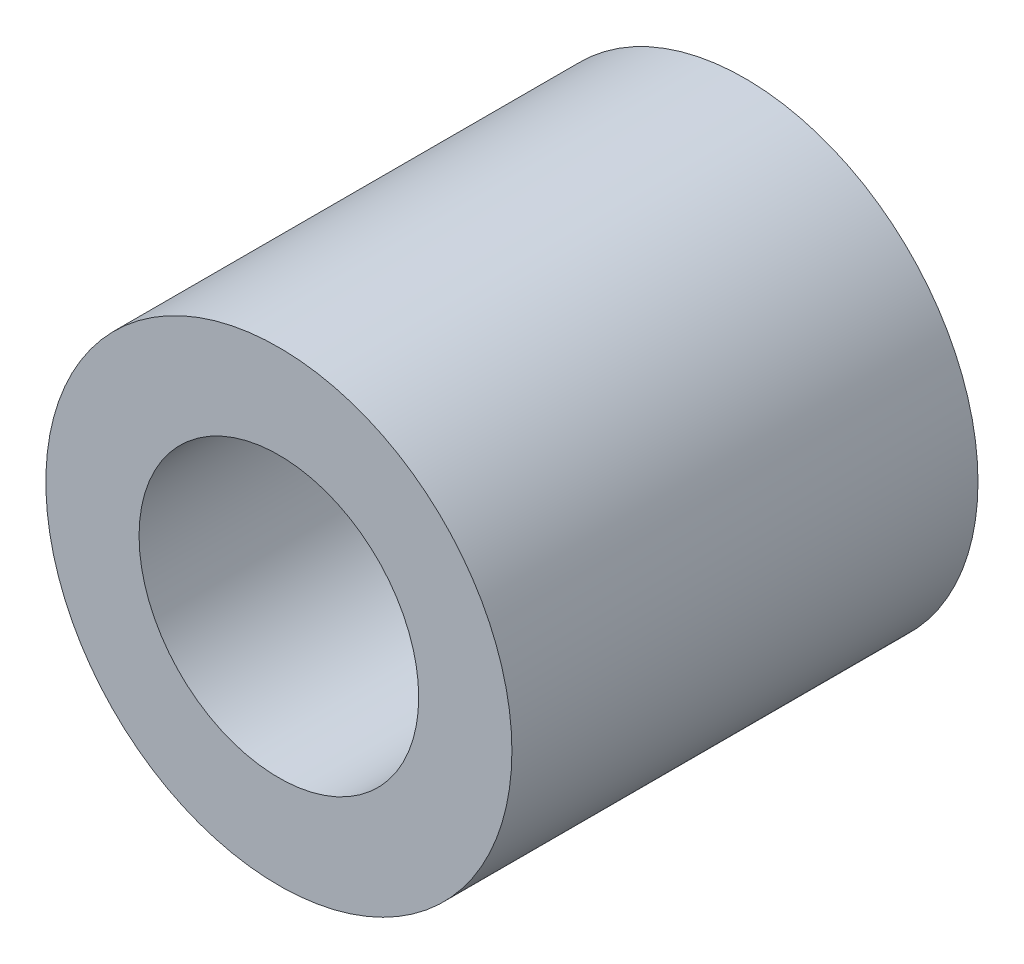
ISO-10303-21;
HEADER;
FILE_DESCRIPTION(('STEP AP214'),'2;1');
FILE_NAME('part.step','',(''),(''),'','','');
FILE_SCHEMA(('AUTOMOTIVE_DESIGN { 1 0 10303 214 1 1 1 1 }'));
ENDSEC;
DATA;
#1=APPLICATION_CONTEXT('core data for automotive mechanical design processes');
#2=APPLICATION_PROTOCOL_DEFINITION('international standard','automotive_design',2000,#1);
#3=PRODUCT_CONTEXT('',#1,'mechanical');
#4=PRODUCT('Part','Part','',(#3));
#5=PRODUCT_RELATED_PRODUCT_CATEGORY('part','',(#4));
#6=PRODUCT_DEFINITION_FORMATION('','',#4);
#7=PRODUCT_DEFINITION_CONTEXT('part definition',#1,'design');
#8=PRODUCT_DEFINITION('design','',#6,#7);
#9=PRODUCT_DEFINITION_SHAPE('','',#8);
#10=(LENGTH_UNIT() NAMED_UNIT(*) SI_UNIT(.MILLI.,.METRE.));
#11=(NAMED_UNIT(*) PLANE_ANGLE_UNIT() SI_UNIT($,.RADIAN.));
#12=(NAMED_UNIT(*) SI_UNIT($,.STERADIAN.) SOLID_ANGLE_UNIT());
#13=UNCERTAINTY_MEASURE_WITH_UNIT(LENGTH_MEASURE(1.E-05),#10,'distance_accuracy_value','');
#14=(GEOMETRIC_REPRESENTATION_CONTEXT(3) GLOBAL_UNCERTAINTY_ASSIGNED_CONTEXT((#13)) GLOBAL_UNIT_ASSIGNED_CONTEXT((#10,
#11,#12)) REPRESENTATION_CONTEXT('',''));
#15=CARTESIAN_POINT('',(0.,0.,0.));
#16=DIRECTION('',(0.,0.,1.));
#17=DIRECTION('',(1.,0.,0.));
#18=AXIS2_PLACEMENT_3D('',#15,#16,#17);
#19=CARTESIAN_POINT('',(0.,0.,5.));
#20=DIRECTION('',(0.,0.,1.));
#21=DIRECTION('',(1.,0.,0.));
#22=AXIS2_PLACEMENT_3D('',#19,#20,#21);
#23=PLANE('',#22);
#24=CARTESIAN_POINT('',(0.,0.,5.));
#25=DIRECTION('',(0.,0.,1.));
#26=DIRECTION('',(1.,0.,0.));
#27=AXIS2_PLACEMENT_3D('',#24,#25,#26);
#28=CIRCLE('',#27,2.5);
#29=CARTESIAN_POINT('',(2.5,0.,5.));
#30=VERTEX_POINT('',#29);
#31=EDGE_CURVE('E10',#30,#30,#28,.T.);
#32=ORIENTED_EDGE('',*,*,#31,.T.);
#33=EDGE_LOOP('',(#32));
#34=FACE_BOUND('',#33,.T.);
#35=CARTESIAN_POINT('',(0.,0.,5.));
#36=DIRECTION('',(0.,0.,1.));
#37=DIRECTION('',(1.,0.,0.));
#38=AXIS2_PLACEMENT_3D('',#35,#36,#37);
#39=CIRCLE('',#38,1.5);
#40=CARTESIAN_POINT('',(1.5,0.,5.));
#41=VERTEX_POINT('',#40);
#42=EDGE_CURVE('E54',#41,#41,#39,.T.);
#43=ORIENTED_EDGE('',*,*,#42,.F.);
#44=EDGE_LOOP('',(#43));
#45=FACE_BOUND('',#44,.T.);
#46=ADVANCED_FACE('F41',(#34,#45),#23,.T.);
#47=CARTESIAN_POINT('',(0.,0.,0.));
#48=DIRECTION('',(0.,0.,1.));
#49=DIRECTION('',(1.,0.,0.));
#50=AXIS2_PLACEMENT_3D('',#47,#48,#49);
#51=PLANE('',#50);
#52=CARTESIAN_POINT('',(0.,0.,0.));
#53=DIRECTION('',(0.,0.,1.));
#54=DIRECTION('',(1.,0.,0.));
#55=AXIS2_PLACEMENT_3D('',#52,#53,#54);
#56=CIRCLE('',#55,2.5);
#57=CARTESIAN_POINT('',(2.5,0.,0.));
#58=VERTEX_POINT('',#57);
#59=EDGE_CURVE('E45',#58,#58,#56,.T.);
#60=ORIENTED_EDGE('',*,*,#59,.F.);
#61=EDGE_LOOP('',(#60));
#62=FACE_BOUND('',#61,.T.);
#63=CARTESIAN_POINT('',(0.,0.,0.));
#64=DIRECTION('',(0.,0.,1.));
#65=DIRECTION('',(1.,0.,0.));
#66=AXIS2_PLACEMENT_3D('',#63,#64,#65);
#67=CIRCLE('',#66,1.5);
#68=CARTESIAN_POINT('',(1.5,0.,0.));
#69=VERTEX_POINT('',#68);
#70=EDGE_CURVE('E56',#69,#69,#67,.T.);
#71=ORIENTED_EDGE('',*,*,#70,.T.);
#72=EDGE_LOOP('',(#71));
#73=FACE_BOUND('',#72,.T.);
#74=ADVANCED_FACE('F68',(#62,#73),#51,.F.);
#75=CARTESIAN_POINT('',(0.,0.,5.));
#76=DIRECTION('',(0.,0.,-1.));
#77=DIRECTION('',(-1.,0.,0.));
#78=AXIS2_PLACEMENT_3D('',#75,#76,#77);
#79=CYLINDRICAL_SURFACE('',#78,2.5);
#80=ORIENTED_EDGE('',*,*,#31,.F.);
#81=EDGE_LOOP('',(#80));
#82=FACE_BOUND('',#81,.T.);
#83=ORIENTED_EDGE('',*,*,#59,.T.);
#84=EDGE_LOOP('',(#83));
#85=FACE_BOUND('',#84,.T.);
#86=ADVANCED_FACE('F43',(#82,#85),#79,.T.);
#87=CARTESIAN_POINT('',(0.,0.,5.));
#88=DIRECTION('',(0.,0.,-1.));
#89=DIRECTION('',(-1.,0.,0.));
#90=AXIS2_PLACEMENT_3D('',#87,#88,#89);
#91=CYLINDRICAL_SURFACE('',#90,1.5);
#92=ORIENTED_EDGE('',*,*,#42,.T.);
#93=EDGE_LOOP('',(#92));
#94=FACE_BOUND('',#93,.T.);
#95=ORIENTED_EDGE('',*,*,#70,.F.);
#96=EDGE_LOOP('',(#95));
#97=FACE_BOUND('',#96,.T.);
#98=ADVANCED_FACE('F64',(#94,#97),#91,.F.);
#99=CLOSED_SHELL('',(#46,#74,#86,#98));
#100=MANIFOLD_SOLID_BREP('B2',#99);
#101=ADVANCED_BREP_SHAPE_REPRESENTATION('',(#18,#100),#14);
#102=SHAPE_DEFINITION_REPRESENTATION(#9,#101);
ENDSEC;
END-ISO-10303-21;
